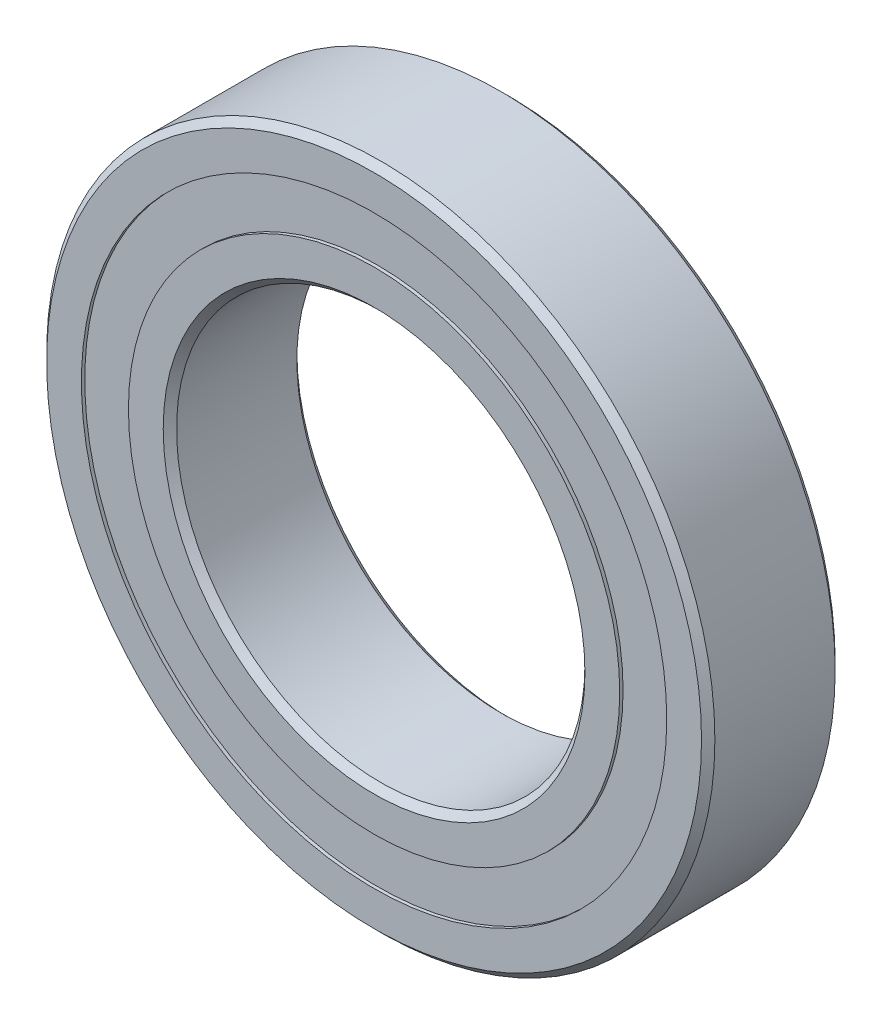
ISO-10303-21;
HEADER;
FILE_DESCRIPTION(('STEP AP214'),'2;1');
FILE_NAME('part.step','',(''),(''),'','','');
FILE_SCHEMA(('AUTOMOTIVE_DESIGN { 1 0 10303 214 1 1 1 1 }'));
ENDSEC;
DATA;
#1=APPLICATION_CONTEXT('core data for automotive mechanical design processes');
#2=APPLICATION_PROTOCOL_DEFINITION('international standard','automotive_design',2000,#1);
#3=PRODUCT_CONTEXT('',#1,'mechanical');
#4=PRODUCT('Part','Part','',(#3));
#5=PRODUCT_RELATED_PRODUCT_CATEGORY('part','',(#4));
#6=PRODUCT_DEFINITION_FORMATION('','',#4);
#7=PRODUCT_DEFINITION_CONTEXT('part definition',#1,'design');
#8=PRODUCT_DEFINITION('design','',#6,#7);
#9=PRODUCT_DEFINITION_SHAPE('','',#8);
#10=(LENGTH_UNIT() NAMED_UNIT(*) SI_UNIT(.MILLI.,.METRE.));
#11=(NAMED_UNIT(*) PLANE_ANGLE_UNIT() SI_UNIT($,.RADIAN.));
#12=(NAMED_UNIT(*) SI_UNIT($,.STERADIAN.) SOLID_ANGLE_UNIT());
#13=UNCERTAINTY_MEASURE_WITH_UNIT(LENGTH_MEASURE(1.E-05),#10,'distance_accuracy_value','');
#14=(GEOMETRIC_REPRESENTATION_CONTEXT(3) GLOBAL_UNCERTAINTY_ASSIGNED_CONTEXT((#13)) GLOBAL_UNIT_ASSIGNED_CONTEXT((#10,
#11,#12)) REPRESENTATION_CONTEXT('',''));
#15=CARTESIAN_POINT('',(0.,0.,0.));
#16=DIRECTION('',(0.,0.,1.));
#17=DIRECTION('',(1.,0.,0.));
#18=AXIS2_PLACEMENT_3D('',#15,#16,#17);
#19=CARTESIAN_POINT('',(0.,39.4148351648352,-8.55000000000001));
#20=DIRECTION('',(0.,0.,1.));
#21=DIRECTION('',(1.,0.,0.));
#22=AXIS2_PLACEMENT_3D('',#19,#20,#21);
#23=PLANE('',#22);
#24=CARTESIAN_POINT('',(0.,0.,-8.55000000000001));
#25=DIRECTION('',(0.,0.,1.));
#26=DIRECTION('',(1.,0.,0.));
#27=AXIS2_PLACEMENT_3D('',#24,#25,#26);
#28=CIRCLE('',#27,39.4148351648352);
#29=CARTESIAN_POINT('',(39.4148351648352,0.,-8.55000000000001));
#30=VERTEX_POINT('',#29);
#31=EDGE_CURVE('E60',#30,#30,#28,.T.);
#32=ORIENTED_EDGE('',*,*,#31,.F.);
#33=EDGE_LOOP('',(#32));
#34=FACE_BOUND('',#33,.T.);
#35=CARTESIAN_POINT('',(0.,0.,-8.55000000000001));
#36=DIRECTION('',(0.,0.,1.));
#37=DIRECTION('',(1.,0.,0.));
#38=AXIS2_PLACEMENT_3D('',#35,#36,#37);
#39=CIRCLE('',#38,33.0851648351648);
#40=CARTESIAN_POINT('',(33.0851648351648,0.,-8.55000000000001));
#41=VERTEX_POINT('',#40);
#42=EDGE_CURVE('E11',#41,#41,#39,.T.);
#43=ORIENTED_EDGE('',*,*,#42,.T.);
#44=EDGE_LOOP('',(#43));
#45=FACE_BOUND('',#44,.T.);
#46=ADVANCED_FACE('F46',(#34,#45),#23,.F.);
#47=CARTESIAN_POINT('',(0.,0.,9.));
#48=DIRECTION('',(0.,0.,1.));
#49=DIRECTION('',(1.,0.,0.));
#50=AXIS2_PLACEMENT_3D('',#47,#48,#49);
#51=CYLINDRICAL_SURFACE('',#50,33.0851648351648);
#52=ORIENTED_EDGE('',*,*,#42,.F.);
#53=EDGE_LOOP('',(#52));
#54=FACE_BOUND('',#53,.T.);
#55=CARTESIAN_POINT('',(0.,0.,-5.10060600522891));
#56=DIRECTION('',(0.,0.,1.));
#57=DIRECTION('',(1.,0.,0.));
#58=AXIS2_PLACEMENT_3D('',#55,#56,#57);
#59=CIRCLE('',#58,33.0851648351648);
#60=CARTESIAN_POINT('',(33.0851648351648,0.,-5.10060600522891));
#61=VERTEX_POINT('',#60);
#62=EDGE_CURVE('E52',#61,#61,#59,.T.);
#63=ORIENTED_EDGE('',*,*,#62,.T.);
#64=EDGE_LOOP('',(#63));
#65=FACE_BOUND('',#64,.T.);
#66=ADVANCED_FACE('F69',(#54,#65),#51,.F.);
#67=CARTESIAN_POINT('',(0.,39.4148351648352,-5.10060600522891));
#68=DIRECTION('',(0.,0.,-1.));
#69=DIRECTION('',(-1.,0.,0.));
#70=AXIS2_PLACEMENT_3D('',#67,#68,#69);
#71=PLANE('',#70);
#72=ORIENTED_EDGE('',*,*,#62,.F.);
#73=EDGE_LOOP('',(#72));
#74=FACE_BOUND('',#73,.T.);
#75=CARTESIAN_POINT('',(0.,0.,-5.10060600522891));
#76=DIRECTION('',(0.,0.,1.));
#77=DIRECTION('',(1.,0.,0.));
#78=AXIS2_PLACEMENT_3D('',#75,#76,#77);
#79=CIRCLE('',#78,39.4148351648352);
#80=CARTESIAN_POINT('',(39.4148351648352,0.,-5.10060600522891));
#81=VERTEX_POINT('',#80);
#82=EDGE_CURVE('E56',#81,#81,#79,.T.);
#83=ORIENTED_EDGE('',*,*,#82,.T.);
#84=EDGE_LOOP('',(#83));
#85=FACE_BOUND('',#84,.T.);
#86=ADVANCED_FACE('F73',(#74,#85),#71,.F.);
#87=CARTESIAN_POINT('',(0.,0.,9.));
#88=DIRECTION('',(0.,0.,1.));
#89=DIRECTION('',(1.,0.,0.));
#90=AXIS2_PLACEMENT_3D('',#87,#88,#89);
#91=CYLINDRICAL_SURFACE('',#90,39.4148351648352);
#92=ORIENTED_EDGE('',*,*,#82,.F.);
#93=EDGE_LOOP('',(#92));
#94=FACE_BOUND('',#93,.T.);
#95=ORIENTED_EDGE('',*,*,#31,.T.);
#96=EDGE_LOOP('',(#95));
#97=FACE_BOUND('',#96,.T.);
#98=ADVANCED_FACE('F66',(#94,#97),#91,.T.);
#99=CLOSED_SHELL('',(#46,#66,#86,#98));
#100=MANIFOLD_SOLID_BREP('B2',#99);
#101=CARTESIAN_POINT('',(0.,39.4148351648352,8.55000000000001));
#102=DIRECTION('',(0.,0.,-1.));
#103=DIRECTION('',(-1.,0.,0.));
#104=AXIS2_PLACEMENT_3D('',#101,#102,#103);
#105=PLANE('',#104);
#106=CARTESIAN_POINT('',(0.,0.,8.55000000000001));
#107=DIRECTION('',(0.,0.,1.));
#108=DIRECTION('',(1.,0.,0.));
#109=AXIS2_PLACEMENT_3D('',#106,#107,#108);
#110=CIRCLE('',#109,33.0851648351648);
#111=CARTESIAN_POINT('',(33.0851648351648,0.,8.55000000000001));
#112=VERTEX_POINT('',#111);
#113=EDGE_CURVE('E45',#112,#112,#110,.T.);
#114=ORIENTED_EDGE('',*,*,#113,.F.);
#115=EDGE_LOOP('',(#114));
#116=FACE_BOUND('',#115,.T.);
#117=CARTESIAN_POINT('',(0.,0.,8.55000000000001));
#118=DIRECTION('',(0.,0.,1.));
#119=DIRECTION('',(1.,0.,0.));
#120=AXIS2_PLACEMENT_3D('',#117,#118,#119);
#121=CIRCLE('',#120,39.4148351648352);
#122=CARTESIAN_POINT('',(39.4148351648352,0.,8.55000000000001));
#123=VERTEX_POINT('',#122);
#124=EDGE_CURVE('E128',#123,#123,#121,.T.);
#125=ORIENTED_EDGE('',*,*,#124,.T.);
#126=EDGE_LOOP('',(#125));
#127=FACE_BOUND('',#126,.T.);
#128=ADVANCED_FACE('F114',(#116,#127),#105,.F.);
#129=CARTESIAN_POINT('',(0.,0.,9.));
#130=DIRECTION('',(0.,0.,1.));
#131=DIRECTION('',(1.,0.,0.));
#132=AXIS2_PLACEMENT_3D('',#129,#130,#131);
#133=CYLINDRICAL_SURFACE('',#132,33.0851648351648);
#134=CARTESIAN_POINT('',(0.,0.,5.1006060052289));
#135=DIRECTION('',(0.,0.,1.));
#136=DIRECTION('',(1.,0.,0.));
#137=AXIS2_PLACEMENT_3D('',#134,#135,#136);
#138=CIRCLE('',#137,33.0851648351648);
#139=CARTESIAN_POINT('',(33.0851648351648,0.,5.1006060052289));
#140=VERTEX_POINT('',#139);
#141=EDGE_CURVE('E120',#140,#140,#138,.T.);
#142=ORIENTED_EDGE('',*,*,#141,.F.);
#143=EDGE_LOOP('',(#142));
#144=FACE_BOUND('',#143,.T.);
#145=ORIENTED_EDGE('',*,*,#113,.T.);
#146=EDGE_LOOP('',(#145));
#147=FACE_BOUND('',#146,.T.);
#148=ADVANCED_FACE('F143',(#144,#147),#133,.F.);
#149=CARTESIAN_POINT('',(0.,39.4148351648352,5.1006060052289));
#150=DIRECTION('',(0.,0.,1.));
#151=DIRECTION('',(1.,0.,0.));
#152=AXIS2_PLACEMENT_3D('',#149,#150,#151);
#153=PLANE('',#152);
#154=CARTESIAN_POINT('',(0.,0.,5.1006060052289));
#155=DIRECTION('',(0.,0.,1.));
#156=DIRECTION('',(1.,0.,0.));
#157=AXIS2_PLACEMENT_3D('',#154,#155,#156);
#158=CIRCLE('',#157,39.4148351648352);
#159=CARTESIAN_POINT('',(39.4148351648352,0.,5.1006060052289));
#160=VERTEX_POINT('',#159);
#161=EDGE_CURVE('E124',#160,#160,#158,.T.);
#162=ORIENTED_EDGE('',*,*,#161,.F.);
#163=EDGE_LOOP('',(#162));
#164=FACE_BOUND('',#163,.T.);
#165=ORIENTED_EDGE('',*,*,#141,.T.);
#166=EDGE_LOOP('',(#165));
#167=FACE_BOUND('',#166,.T.);
#168=ADVANCED_FACE('F138',(#164,#167),#153,.F.);
#169=CARTESIAN_POINT('',(0.,0.,9.));
#170=DIRECTION('',(0.,0.,1.));
#171=DIRECTION('',(1.,0.,0.));
#172=AXIS2_PLACEMENT_3D('',#169,#170,#171);
#173=CYLINDRICAL_SURFACE('',#172,39.4148351648352);
#174=ORIENTED_EDGE('',*,*,#124,.F.);
#175=EDGE_LOOP('',(#174));
#176=FACE_BOUND('',#175,.T.);
#177=ORIENTED_EDGE('',*,*,#161,.T.);
#178=EDGE_LOOP('',(#177));
#179=FACE_BOUND('',#178,.T.);
#180=ADVANCED_FACE('F135',(#176,#179),#173,.T.);
#181=CLOSED_SHELL('',(#128,#148,#168,#180));
#182=MANIFOLD_SOLID_BREP('B6',#181);
#183=CARTESIAN_POINT('',(-18.1249999999996,31.3934208871861,0.));
#184=DIRECTION('',(0.,0.,1.));
#185=DIRECTION('',(-0.499999999999989,0.866025403784445,0.));
#186=AXIS2_PLACEMENT_3D('',#183,#184,#185);
#187=SPHERICAL_SURFACE('',#186,5.10060600522891);
#188=CARTESIAN_POINT('',(-18.1249999999996,31.3934208871861,5.1006060052289));
#189=VERTEX_POINT('',#188);
#190=VERTEX_LOOP('',#189);
#191=FACE_BOUND('',#190,.T.);
#192=ADVANCED_FACE('F182',(#191),#187,.T.);
#193=CLOSED_SHELL('',(#192));
#194=MANIFOLD_SOLID_BREP('B40',#193);
#195=CARTESIAN_POINT('',(-31.3934208871857,18.1250000000004,0.));
#196=DIRECTION('',(0.,0.,1.));
#197=DIRECTION('',(-0.866025403784433,0.50000000000001,0.));
#198=AXIS2_PLACEMENT_3D('',#195,#196,#197);
#199=SPHERICAL_SURFACE('',#198,5.10060600522891);
#200=CARTESIAN_POINT('',(-31.3934208871857,18.1250000000004,5.1006060052289));
#201=VERTEX_POINT('',#200);
#202=VERTEX_LOOP('',#201);
#203=FACE_BOUND('',#202,.T.);
#204=ADVANCED_FACE('F203',(#203),#199,.T.);
#205=CLOSED_SHELL('',(#204));
#206=MANIFOLD_SOLID_BREP('B110',#205);
#207=CARTESIAN_POINT('',(-36.25,3.79698595599191E-13,0.));
#208=DIRECTION('',(0.,0.,1.));
#209=DIRECTION('',(-1.,0.,0.));
#210=AXIS2_PLACEMENT_3D('',#207,#208,#209);
#211=SPHERICAL_SURFACE('',#210,5.10060600522891);
#212=CARTESIAN_POINT('',(-36.25,3.79698595599191E-13,5.1006060052289));
#213=VERTEX_POINT('',#212);
#214=VERTEX_LOOP('',#213);
#215=FACE_BOUND('',#214,.T.);
#216=ADVANCED_FACE('F224',(#215),#211,.T.);
#217=CLOSED_SHELL('',(#216));
#218=MANIFOLD_SOLID_BREP('B178',#217);
#219=CARTESIAN_POINT('',(-31.3934208871861,-18.1249999999997,0.));
#220=DIRECTION('',(0.,0.,1.));
#221=DIRECTION('',(-0.866025403784443,-0.499999999999992,0.));
#222=AXIS2_PLACEMENT_3D('',#219,#220,#221);
#223=SPHERICAL_SURFACE('',#222,5.10060600522891);
#224=CARTESIAN_POINT('',(-31.3934208871861,-18.1249999999997,5.1006060052289));
#225=VERTEX_POINT('',#224);
#226=VERTEX_LOOP('',#225);
#227=FACE_BOUND('',#226,.T.);
#228=ADVANCED_FACE('F245',(#227),#223,.T.);
#229=CLOSED_SHELL('',(#228));
#230=MANIFOLD_SOLID_BREP('B199',#229);
#231=CARTESIAN_POINT('',(-18.1250000000003,-31.3934208871858,0.));
#232=DIRECTION('',(0.,0.,1.));
#233=DIRECTION('',(-0.500000000000007,-0.866025403784435,0.));
#234=AXIS2_PLACEMENT_3D('',#231,#232,#233);
#235=SPHERICAL_SURFACE('',#234,5.10060600522891);
#236=CARTESIAN_POINT('',(-18.1250000000003,-31.3934208871858,5.1006060052289));
#237=VERTEX_POINT('',#236);
#238=VERTEX_LOOP('',#237);
#239=FACE_BOUND('',#238,.T.);
#240=ADVANCED_FACE('F266',(#239),#235,.T.);
#241=CLOSED_SHELL('',(#240));
#242=MANIFOLD_SOLID_BREP('B220',#241);
#243=CARTESIAN_POINT('',(-2.53132397066127E-13,-36.25,0.));
#244=DIRECTION('',(0.,0.,1.));
#245=DIRECTION('',(0.,-1.,0.));
#246=AXIS2_PLACEMENT_3D('',#243,#244,#245);
#247=SPHERICAL_SURFACE('',#246,5.10060600522891);
#248=CARTESIAN_POINT('',(-2.53132397066127E-13,-36.25,5.1006060052289));
#249=VERTEX_POINT('',#248);
#250=VERTEX_LOOP('',#249);
#251=FACE_BOUND('',#250,.T.);
#252=ADVANCED_FACE('F287',(#251),#247,.T.);
#253=CLOSED_SHELL('',(#252));
#254=MANIFOLD_SOLID_BREP('B241',#253);
#255=CARTESIAN_POINT('',(18.1249999999998,-31.393420887186,0.));
#256=DIRECTION('',(0.,0.,1.));
#257=DIRECTION('',(0.499999999999995,-0.866025403784442,0.));
#258=AXIS2_PLACEMENT_3D('',#255,#256,#257);
#259=SPHERICAL_SURFACE('',#258,5.10060600522891);
#260=CARTESIAN_POINT('',(18.1249999999998,-31.393420887186,5.1006060052289));
#261=VERTEX_POINT('',#260);
#262=VERTEX_LOOP('',#261);
#263=FACE_BOUND('',#262,.T.);
#264=ADVANCED_FACE('F308',(#263),#259,.T.);
#265=CLOSED_SHELL('',(#264));
#266=MANIFOLD_SOLID_BREP('B262',#265);
#267=CARTESIAN_POINT('',(31.3934208871858,-18.1250000000001,0.));
#268=DIRECTION('',(0.,0.,1.));
#269=DIRECTION('',(0.866025403784436,-0.500000000000004,0.));
#270=AXIS2_PLACEMENT_3D('',#267,#268,#269);
#271=SPHERICAL_SURFACE('',#270,5.10060600522891);
#272=CARTESIAN_POINT('',(31.3934208871858,-18.1250000000001,5.1006060052289));
#273=VERTEX_POINT('',#272);
#274=VERTEX_LOOP('',#273);
#275=FACE_BOUND('',#274,.T.);
#276=ADVANCED_FACE('F329',(#275),#271,.T.);
#277=CLOSED_SHELL('',(#276));
#278=MANIFOLD_SOLID_BREP('B283',#277);
#279=CARTESIAN_POINT('',(36.25,-1.26566198533064E-13,0.));
#280=DIRECTION('',(0.,0.,1.));
#281=DIRECTION('',(1.,0.,0.));
#282=AXIS2_PLACEMENT_3D('',#279,#280,#281);
#283=SPHERICAL_SURFACE('',#282,5.10060600522891);
#284=CARTESIAN_POINT('',(36.25,-1.26566198533064E-13,5.1006060052289));
#285=VERTEX_POINT('',#284);
#286=VERTEX_LOOP('',#285);
#287=FACE_BOUND('',#286,.T.);
#288=ADVANCED_FACE('F350',(#287),#283,.T.);
#289=CLOSED_SHELL('',(#288));
#290=MANIFOLD_SOLID_BREP('B304',#289);
#291=CARTESIAN_POINT('',(31.3934208871859,18.1249999999999,0.));
#292=DIRECTION('',(0.,0.,1.));
#293=DIRECTION('',(0.86602540378444,0.499999999999998,0.));
#294=AXIS2_PLACEMENT_3D('',#291,#292,#293);
#295=SPHERICAL_SURFACE('',#294,5.10060600522891);
#296=CARTESIAN_POINT('',(31.3934208871859,18.1249999999999,5.1006060052289));
#297=VERTEX_POINT('',#296);
#298=VERTEX_LOOP('',#297);
#299=FACE_BOUND('',#298,.T.);
#300=ADVANCED_FACE('F371',(#299),#295,.T.);
#301=CLOSED_SHELL('',(#300));
#302=MANIFOLD_SOLID_BREP('B325',#301);
#303=CARTESIAN_POINT('',(18.125,31.3934208871859,0.));
#304=DIRECTION('',(0.,0.,1.));
#305=DIRECTION('',(0.500000000000001,0.866025403784438,0.));
#306=AXIS2_PLACEMENT_3D('',#303,#304,#305);
#307=SPHERICAL_SURFACE('',#306,5.10060600522891);
#308=CARTESIAN_POINT('',(18.125,31.3934208871859,5.1006060052289));
#309=VERTEX_POINT('',#308);
#310=VERTEX_LOOP('',#309);
#311=FACE_BOUND('',#310,.T.);
#312=ADVANCED_FACE('F392',(#311),#307,.T.);
#313=CLOSED_SHELL('',(#312));
#314=MANIFOLD_SOLID_BREP('B346',#313);
#315=CARTESIAN_POINT('',(0.,36.25,0.));
#316=DIRECTION('',(0.,0.,1.));
#317=DIRECTION('',(0.,1.,0.));
#318=AXIS2_PLACEMENT_3D('',#315,#316,#317);
#319=SPHERICAL_SURFACE('',#318,5.10060600522891);
#320=CARTESIAN_POINT('',(0.,36.25,5.1006060052289));
#321=VERTEX_POINT('',#320);
#322=VERTEX_LOOP('',#321);
#323=FACE_BOUND('',#322,.T.);
#324=ADVANCED_FACE('F415',(#323),#319,.T.);
#325=CLOSED_SHELL('',(#324));
#326=MANIFOLD_SOLID_BREP('B367',#325);
#327=CARTESIAN_POINT('',(0.,33.0851648351648,9.00000000000001));
#328=DIRECTION('',(0.,0.,-1.));
#329=DIRECTION('',(-1.,0.,0.));
#330=AXIS2_PLACEMENT_3D('',#327,#328,#329);
#331=PLANE('',#330);
#332=CARTESIAN_POINT('',(0.,0.,9.00000000000001));
#333=DIRECTION('',(0.,0.,1.));
#334=DIRECTION('',(1.,0.,0.));
#335=AXIS2_PLACEMENT_3D('',#332,#333,#334);
#336=CIRCLE('',#335,28.4);
#337=CARTESIAN_POINT('',(28.4,0.,9.00000000000001));
#338=VERTEX_POINT('',#337);
#339=EDGE_CURVE('E463',#338,#338,#336,.T.);
#340=ORIENTED_EDGE('',*,*,#339,.F.);
#341=EDGE_LOOP('',(#340));
#342=FACE_BOUND('',#341,.T.);
#343=CARTESIAN_POINT('',(0.,0.,9.00000000000001));
#344=DIRECTION('',(0.,0.,1.));
#345=DIRECTION('',(1.,0.,0.));
#346=AXIS2_PLACEMENT_3D('',#343,#344,#345);
#347=CIRCLE('',#346,33.0851648351648);
#348=CARTESIAN_POINT('',(33.0851648351648,0.,9.00000000000001));
#349=VERTEX_POINT('',#348);
#350=EDGE_CURVE('E414',#349,#349,#347,.T.);
#351=ORIENTED_EDGE('',*,*,#350,.T.);
#352=EDGE_LOOP('',(#351));
#353=FACE_BOUND('',#352,.T.);
#354=ADVANCED_FACE('F435',(#342,#353),#331,.F.);
#355=CARTESIAN_POINT('',(0.,0.,9.));
#356=DIRECTION('',(0.,0.,1.));
#357=DIRECTION('',(1.,0.,0.));
#358=AXIS2_PLACEMENT_3D('',#355,#356,#357);
#359=CYLINDRICAL_SURFACE('',#358,33.0851648351648);
#360=ORIENTED_EDGE('',*,*,#350,.F.);
#361=EDGE_LOOP('',(#360));
#362=FACE_BOUND('',#361,.T.);
#363=CARTESIAN_POINT('',(0.,0.,4.));
#364=DIRECTION('',(0.,0.,1.));
#365=DIRECTION('',(1.,0.,0.));
#366=AXIS2_PLACEMENT_3D('',#363,#364,#365);
#367=CIRCLE('',#366,33.0851648351648);
#368=CARTESIAN_POINT('',(33.0851648351648,0.,4.));
#369=VERTEX_POINT('',#368);
#370=EDGE_CURVE('E441',#369,#369,#367,.T.);
#371=ORIENTED_EDGE('',*,*,#370,.T.);
#372=EDGE_LOOP('',(#371));
#373=FACE_BOUND('',#372,.T.);
#374=ADVANCED_FACE('F470',(#362,#373),#359,.T.);
#375=CARTESIAN_POINT('',(0.,0.,0.));
#376=DIRECTION('',(0.,0.,1.));
#377=DIRECTION('',(1.,0.,0.));
#378=AXIS2_PLACEMENT_3D('',#375,#376,#377);
#379=TOROIDAL_SURFACE('',#378,36.25,5.1006060052289);
#380=ORIENTED_EDGE('',*,*,#370,.F.);
#381=EDGE_LOOP('',(#380));
#382=FACE_BOUND('',#381,.T.);
#383=CARTESIAN_POINT('',(0.,0.,-4.00000000000001));
#384=DIRECTION('',(0.,0.,1.));
#385=DIRECTION('',(1.,0.,0.));
#386=AXIS2_PLACEMENT_3D('',#383,#384,#385);
#387=CIRCLE('',#386,33.0851648351648);
#388=CARTESIAN_POINT('',(33.0851648351648,0.,-4.00000000000001));
#389=VERTEX_POINT('',#388);
#390=EDGE_CURVE('E445',#389,#389,#387,.T.);
#391=ORIENTED_EDGE('',*,*,#390,.T.);
#392=EDGE_LOOP('',(#391));
#393=FACE_BOUND('',#392,.T.);
#394=ADVANCED_FACE('F474',(#382,#393),#379,.F.);
#395=CARTESIAN_POINT('',(0.,0.,9.));
#396=DIRECTION('',(0.,0.,1.));
#397=DIRECTION('',(1.,0.,0.));
#398=AXIS2_PLACEMENT_3D('',#395,#396,#397);
#399=CYLINDRICAL_SURFACE('',#398,33.0851648351648);
#400=ORIENTED_EDGE('',*,*,#390,.F.);
#401=EDGE_LOOP('',(#400));
#402=FACE_BOUND('',#401,.T.);
#403=CARTESIAN_POINT('',(0.,0.,-9.00000000000001));
#404=DIRECTION('',(0.,0.,1.));
#405=DIRECTION('',(1.,0.,0.));
#406=AXIS2_PLACEMENT_3D('',#403,#404,#405);
#407=CIRCLE('',#406,33.0851648351648);
#408=CARTESIAN_POINT('',(33.0851648351648,0.,-9.00000000000001));
#409=VERTEX_POINT('',#408);
#410=EDGE_CURVE('E449',#409,#409,#407,.T.);
#411=ORIENTED_EDGE('',*,*,#410,.T.);
#412=EDGE_LOOP('',(#411));
#413=FACE_BOUND('',#412,.T.);
#414=ADVANCED_FACE('F479',(#402,#413),#399,.T.);
#415=CARTESIAN_POINT('',(0.,28.4,-9.00000000000001));
#416=DIRECTION('',(0.,0.,1.));
#417=DIRECTION('',(1.,0.,0.));
#418=AXIS2_PLACEMENT_3D('',#415,#416,#417);
#419=PLANE('',#418);
#420=ORIENTED_EDGE('',*,*,#410,.F.);
#421=EDGE_LOOP('',(#420));
#422=FACE_BOUND('',#421,.T.);
#423=CARTESIAN_POINT('',(0.,0.,-9.00000000000001));
#424=DIRECTION('',(0.,0.,1.));
#425=DIRECTION('',(1.,0.,0.));
#426=AXIS2_PLACEMENT_3D('',#423,#424,#425);
#427=CIRCLE('',#426,28.4);
#428=CARTESIAN_POINT('',(28.4,0.,-9.00000000000001));
#429=VERTEX_POINT('',#428);
#430=EDGE_CURVE('E454',#429,#429,#427,.T.);
#431=ORIENTED_EDGE('',*,*,#430,.T.);
#432=EDGE_LOOP('',(#431));
#433=FACE_BOUND('',#432,.T.);
#434=ADVANCED_FACE('F485',(#422,#433),#419,.F.);
#435=CARTESIAN_POINT('',(0.,0.,-8.10000000000001));
#436=DIRECTION('',(0.,0.,-1.));
#437=DIRECTION('',(-1.,0.,0.));
#438=AXIS2_PLACEMENT_3D('',#435,#436,#437);
#439=CONICAL_SURFACE('',#438,27.5,0.78539816339745);
#440=ORIENTED_EDGE('',*,*,#430,.F.);
#441=EDGE_LOOP('',(#440));
#442=FACE_BOUND('',#441,.T.);
#443=CARTESIAN_POINT('',(0.,0.,-8.10000000000001));
#444=DIRECTION('',(0.,0.,1.));
#445=DIRECTION('',(1.,0.,0.));
#446=AXIS2_PLACEMENT_3D('',#443,#444,#445);
#447=CIRCLE('',#446,27.5);
#448=CARTESIAN_POINT('',(27.5,0.,-8.10000000000001));
#449=VERTEX_POINT('',#448);
#450=EDGE_CURVE('E457',#449,#449,#447,.T.);
#451=ORIENTED_EDGE('',*,*,#450,.T.);
#452=EDGE_LOOP('',(#451));
#453=FACE_BOUND('',#452,.T.);
#454=ADVANCED_FACE('F489',(#442,#453),#439,.F.);
#455=CARTESIAN_POINT('',(0.,0.,9.));
#456=DIRECTION('',(0.,0.,1.));
#457=DIRECTION('',(1.,0.,0.));
#458=AXIS2_PLACEMENT_3D('',#455,#456,#457);
#459=CYLINDRICAL_SURFACE('',#458,27.5);
#460=ORIENTED_EDGE('',*,*,#450,.F.);
#461=EDGE_LOOP('',(#460));
#462=FACE_BOUND('',#461,.T.);
#463=CARTESIAN_POINT('',(0.,0.,8.10000000000001));
#464=DIRECTION('',(0.,0.,1.));
#465=DIRECTION('',(1.,0.,0.));
#466=AXIS2_PLACEMENT_3D('',#463,#464,#465);
#467=CIRCLE('',#466,27.5);
#468=CARTESIAN_POINT('',(27.5,0.,8.10000000000001));
#469=VERTEX_POINT('',#468);
#470=EDGE_CURVE('E460',#469,#469,#467,.T.);
#471=ORIENTED_EDGE('',*,*,#470,.T.);
#472=EDGE_LOOP('',(#471));
#473=FACE_BOUND('',#472,.T.);
#474=ADVANCED_FACE('F493',(#462,#473),#459,.F.);
#475=CARTESIAN_POINT('',(0.,0.,9.00000000000001));
#476=DIRECTION('',(0.,0.,1.));
#477=DIRECTION('',(1.,0.,0.));
#478=AXIS2_PLACEMENT_3D('',#475,#476,#477);
#479=CONICAL_SURFACE('',#478,28.4,0.785398163397445);
#480=ORIENTED_EDGE('',*,*,#470,.F.);
#481=EDGE_LOOP('',(#480));
#482=FACE_BOUND('',#481,.T.);
#483=ORIENTED_EDGE('',*,*,#339,.T.);
#484=EDGE_LOOP('',(#483));
#485=FACE_BOUND('',#484,.T.);
#486=ADVANCED_FACE('F467',(#482,#485),#479,.F.);
#487=CLOSED_SHELL('',(#354,#374,#394,#414,#434,#454,#474,#486));
#488=MANIFOLD_SOLID_BREP('B388',#487);
#489=CARTESIAN_POINT('',(0.,0.,8.1));
#490=DIRECTION('',(0.,0.,-1.));
#491=DIRECTION('',(-1.,0.,0.));
#492=AXIS2_PLACEMENT_3D('',#489,#490,#491);
#493=CONICAL_SURFACE('',#492,45.,0.785398163397451);
#494=CARTESIAN_POINT('',(0.,0.,9.00000000000001));
#495=DIRECTION('',(0.,0.,1.));
#496=DIRECTION('',(1.,0.,0.));
#497=AXIS2_PLACEMENT_3D('',#494,#495,#496);
#498=CIRCLE('',#497,44.1);
#499=CARTESIAN_POINT('',(44.1,0.,9.00000000000001));
#500=VERTEX_POINT('',#499);
#501=EDGE_CURVE('E585',#500,#500,#498,.T.);
#502=ORIENTED_EDGE('',*,*,#501,.F.);
#503=EDGE_LOOP('',(#502));
#504=FACE_BOUND('',#503,.T.);
#505=CARTESIAN_POINT('',(0.,0.,8.1));
#506=DIRECTION('',(0.,0.,1.));
#507=DIRECTION('',(1.,0.,0.));
#508=AXIS2_PLACEMENT_3D('',#505,#506,#507);
#509=CIRCLE('',#508,45.);
#510=CARTESIAN_POINT('',(45.,0.,8.1));
#511=VERTEX_POINT('',#510);
#512=EDGE_CURVE('E434',#511,#511,#509,.T.);
#513=ORIENTED_EDGE('',*,*,#512,.T.);
#514=EDGE_LOOP('',(#513));
#515=FACE_BOUND('',#514,.T.);
#516=ADVANCED_FACE('F557',(#504,#515),#493,.T.);
#517=CARTESIAN_POINT('',(0.,0.,9.));
#518=DIRECTION('',(0.,0.,1.));
#519=DIRECTION('',(1.,0.,0.));
#520=AXIS2_PLACEMENT_3D('',#517,#518,#519);
#521=CYLINDRICAL_SURFACE('',#520,45.);
#522=ORIENTED_EDGE('',*,*,#512,.F.);
#523=EDGE_LOOP('',(#522));
#524=FACE_BOUND('',#523,.T.);
#525=CARTESIAN_POINT('',(0.,0.,-8.10000000000001));
#526=DIRECTION('',(0.,0.,1.));
#527=DIRECTION('',(1.,0.,0.));
#528=AXIS2_PLACEMENT_3D('',#525,#526,#527);
#529=CIRCLE('',#528,45.);
#530=CARTESIAN_POINT('',(45.,0.,-8.10000000000001));
#531=VERTEX_POINT('',#530);
#532=EDGE_CURVE('E563',#531,#531,#529,.T.);
#533=ORIENTED_EDGE('',*,*,#532,.T.);
#534=EDGE_LOOP('',(#533));
#535=FACE_BOUND('',#534,.T.);
#536=ADVANCED_FACE('F592',(#524,#535),#521,.T.);
#537=CARTESIAN_POINT('',(0.,0.,-9.00000000000001));
#538=DIRECTION('',(0.,0.,1.));
#539=DIRECTION('',(1.,0.,0.));
#540=AXIS2_PLACEMENT_3D('',#537,#538,#539);
#541=CONICAL_SURFACE('',#540,44.1,0.78539816339745);
#542=ORIENTED_EDGE('',*,*,#532,.F.);
#543=EDGE_LOOP('',(#542));
#544=FACE_BOUND('',#543,.T.);
#545=CARTESIAN_POINT('',(0.,0.,-9.00000000000001));
#546=DIRECTION('',(0.,0.,1.));
#547=DIRECTION('',(1.,0.,0.));
#548=AXIS2_PLACEMENT_3D('',#545,#546,#547);
#549=CIRCLE('',#548,44.1);
#550=CARTESIAN_POINT('',(44.1,0.,-9.00000000000001));
#551=VERTEX_POINT('',#550);
#552=EDGE_CURVE('E567',#551,#551,#549,.T.);
#553=ORIENTED_EDGE('',*,*,#552,.T.);
#554=EDGE_LOOP('',(#553));
#555=FACE_BOUND('',#554,.T.);
#556=ADVANCED_FACE('F596',(#544,#555),#541,.T.);
#557=CARTESIAN_POINT('',(0.,44.1,-9.00000000000001));
#558=DIRECTION('',(0.,0.,1.));
#559=DIRECTION('',(1.,0.,0.));
#560=AXIS2_PLACEMENT_3D('',#557,#558,#559);
#561=PLANE('',#560);
#562=ORIENTED_EDGE('',*,*,#552,.F.);
#563=EDGE_LOOP('',(#562));
#564=FACE_BOUND('',#563,.T.);
#565=CARTESIAN_POINT('',(0.,0.,-9.00000000000001));
#566=DIRECTION('',(0.,0.,1.));
#567=DIRECTION('',(1.,0.,0.));
#568=AXIS2_PLACEMENT_3D('',#565,#566,#567);
#569=CIRCLE('',#568,39.4148351648352);
#570=CARTESIAN_POINT('',(39.4148351648352,0.,-9.00000000000001));
#571=VERTEX_POINT('',#570);
#572=EDGE_CURVE('E571',#571,#571,#569,.T.);
#573=ORIENTED_EDGE('',*,*,#572,.T.);
#574=EDGE_LOOP('',(#573));
#575=FACE_BOUND('',#574,.T.);
#576=ADVANCED_FACE('F601',(#564,#575),#561,.F.);
#577=CARTESIAN_POINT('',(0.,0.,9.));
#578=DIRECTION('',(0.,0.,1.));
#579=DIRECTION('',(1.,0.,0.));
#580=AXIS2_PLACEMENT_3D('',#577,#578,#579);
#581=CYLINDRICAL_SURFACE('',#580,39.4148351648352);
#582=ORIENTED_EDGE('',*,*,#572,.F.);
#583=EDGE_LOOP('',(#582));
#584=FACE_BOUND('',#583,.T.);
#585=CARTESIAN_POINT('',(0.,0.,-4.));
#586=DIRECTION('',(0.,0.,1.));
#587=DIRECTION('',(1.,0.,0.));
#588=AXIS2_PLACEMENT_3D('',#585,#586,#587);
#589=CIRCLE('',#588,39.4148351648352);
#590=CARTESIAN_POINT('',(39.4148351648352,0.,-4.));
#591=VERTEX_POINT('',#590);
#592=EDGE_CURVE('E576',#591,#591,#589,.T.);
#593=ORIENTED_EDGE('',*,*,#592,.T.);
#594=EDGE_LOOP('',(#593));
#595=FACE_BOUND('',#594,.T.);
#596=ADVANCED_FACE('F607',(#584,#595),#581,.F.);
#597=CARTESIAN_POINT('',(0.,0.,0.));
#598=DIRECTION('',(0.,0.,1.));
#599=DIRECTION('',(1.,0.,0.));
#600=AXIS2_PLACEMENT_3D('',#597,#598,#599);
#601=TOROIDAL_SURFACE('',#600,36.25,5.10060600522891);
#602=ORIENTED_EDGE('',*,*,#592,.F.);
#603=EDGE_LOOP('',(#602));
#604=FACE_BOUND('',#603,.T.);
#605=CARTESIAN_POINT('',(0.,0.,4.));
#606=DIRECTION('',(0.,0.,1.));
#607=DIRECTION('',(1.,0.,0.));
#608=AXIS2_PLACEMENT_3D('',#605,#606,#607);
#609=CIRCLE('',#608,39.4148351648352);
#610=CARTESIAN_POINT('',(39.4148351648352,0.,4.));
#611=VERTEX_POINT('',#610);
#612=EDGE_CURVE('E579',#611,#611,#609,.T.);
#613=ORIENTED_EDGE('',*,*,#612,.T.);
#614=EDGE_LOOP('',(#613));
#615=FACE_BOUND('',#614,.T.);
#616=ADVANCED_FACE('F611',(#604,#615),#601,.F.);
#617=CARTESIAN_POINT('',(0.,0.,9.));
#618=DIRECTION('',(0.,0.,1.));
#619=DIRECTION('',(1.,0.,0.));
#620=AXIS2_PLACEMENT_3D('',#617,#618,#619);
#621=CYLINDRICAL_SURFACE('',#620,39.4148351648352);
#622=ORIENTED_EDGE('',*,*,#612,.F.);
#623=EDGE_LOOP('',(#622));
#624=FACE_BOUND('',#623,.T.);
#625=CARTESIAN_POINT('',(0.,0.,9.00000000000001));
#626=DIRECTION('',(0.,0.,1.));
#627=DIRECTION('',(1.,0.,0.));
#628=AXIS2_PLACEMENT_3D('',#625,#626,#627);
#629=CIRCLE('',#628,39.4148351648352);
#630=CARTESIAN_POINT('',(39.4148351648352,0.,9.00000000000001));
#631=VERTEX_POINT('',#630);
#632=EDGE_CURVE('E582',#631,#631,#629,.T.);
#633=ORIENTED_EDGE('',*,*,#632,.T.);
#634=EDGE_LOOP('',(#633));
#635=FACE_BOUND('',#634,.T.);
#636=ADVANCED_FACE('F615',(#624,#635),#621,.F.);
#637=CARTESIAN_POINT('',(0.,44.1,9.00000000000001));
#638=DIRECTION('',(0.,0.,-1.));
#639=DIRECTION('',(-1.,0.,0.));
#640=AXIS2_PLACEMENT_3D('',#637,#638,#639);
#641=PLANE('',#640);
#642=ORIENTED_EDGE('',*,*,#632,.F.);
#643=EDGE_LOOP('',(#642));
#644=FACE_BOUND('',#643,.T.);
#645=ORIENTED_EDGE('',*,*,#501,.T.);
#646=EDGE_LOOP('',(#645));
#647=FACE_BOUND('',#646,.T.);
#648=ADVANCED_FACE('F589',(#644,#647),#641,.F.);
#649=CLOSED_SHELL('',(#516,#536,#556,#576,#596,#616,#636,#648));
#650=MANIFOLD_SOLID_BREP('B409',#649);
#651=ADVANCED_BREP_SHAPE_REPRESENTATION('',(#18,#100,#182,#194,#206,#218,#230,#242,#254,#266,
#278,#290,#302,#314,#326,#488,#650),#14);
#652=SHAPE_DEFINITION_REPRESENTATION(#9,#651);
ENDSEC;
END-ISO-10303-21;
